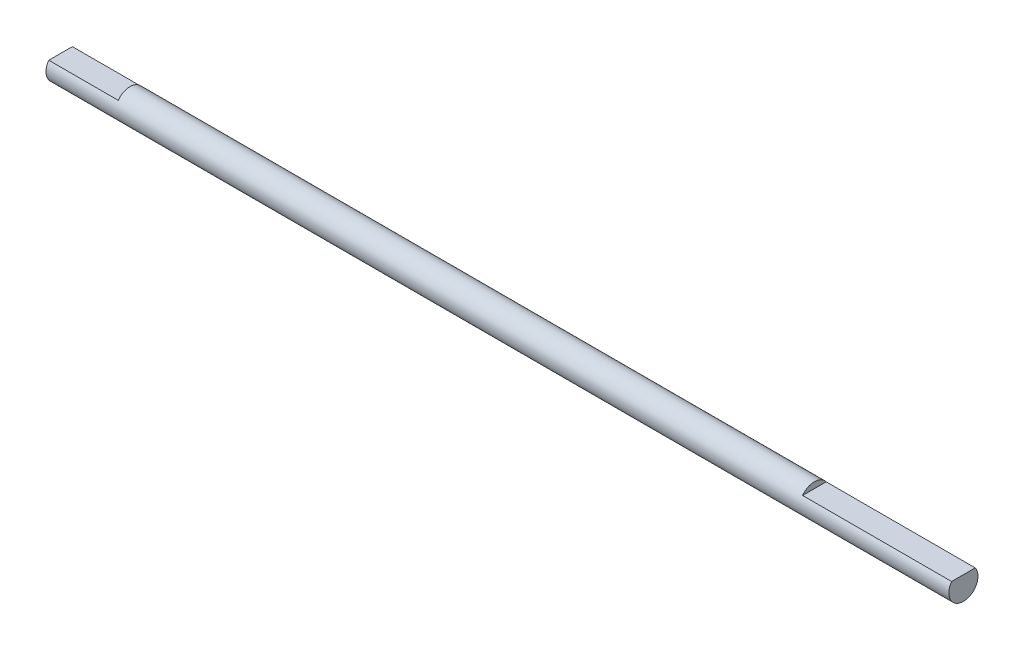
ISO-10303-21;
HEADER;
FILE_DESCRIPTION(('STEP AP214'),'2;1');
FILE_NAME('part.step','',(''),(''),'','','');
FILE_SCHEMA(('AUTOMOTIVE_DESIGN { 1 0 10303 214 1 1 1 1 }'));
ENDSEC;
DATA;
#1=APPLICATION_CONTEXT('core data for automotive mechanical design processes');
#2=APPLICATION_PROTOCOL_DEFINITION('international standard','automotive_design',2000,#1);
#3=PRODUCT_CONTEXT('',#1,'mechanical');
#4=PRODUCT('Part','Part','',(#3));
#5=PRODUCT_RELATED_PRODUCT_CATEGORY('part','',(#4));
#6=PRODUCT_DEFINITION_FORMATION('','',#4);
#7=PRODUCT_DEFINITION_CONTEXT('part definition',#1,'design');
#8=PRODUCT_DEFINITION('design','',#6,#7);
#9=PRODUCT_DEFINITION_SHAPE('','',#8);
#10=(LENGTH_UNIT() NAMED_UNIT(*) SI_UNIT(.MILLI.,.METRE.));
#11=(NAMED_UNIT(*) PLANE_ANGLE_UNIT() SI_UNIT($,.RADIAN.));
#12=(NAMED_UNIT(*) SI_UNIT($,.STERADIAN.) SOLID_ANGLE_UNIT());
#13=UNCERTAINTY_MEASURE_WITH_UNIT(LENGTH_MEASURE(1.E-05),#10,'distance_accuracy_value','');
#14=(GEOMETRIC_REPRESENTATION_CONTEXT(3) GLOBAL_UNCERTAINTY_ASSIGNED_CONTEXT((#13)) GLOBAL_UNIT_ASSIGNED_CONTEXT((#10,
#11,#12)) REPRESENTATION_CONTEXT('',''));
#15=CARTESIAN_POINT('',(0.,0.,0.));
#16=DIRECTION('',(0.,0.,1.));
#17=DIRECTION('',(1.,0.,0.));
#18=AXIS2_PLACEMENT_3D('',#15,#16,#17);
#19=CARTESIAN_POINT('',(123.825,0.,0.));
#20=DIRECTION('',(-1.,0.,0.));
#21=DIRECTION('',(0.,0.,1.));
#22=AXIS2_PLACEMENT_3D('',#19,#20,#21);
#23=CYLINDRICAL_SURFACE('',#22,4.);
#24=CARTESIAN_POINT('',(123.825,0.,0.));
#25=DIRECTION('',(1.,0.,0.));
#26=DIRECTION('',(0.,0.,-1.));
#27=AXIS2_PLACEMENT_3D('',#24,#25,#26);
#28=CIRCLE('',#27,4.);
#29=CARTESIAN_POINT('',(123.825,2.35,3.2368966619279));
#30=VERTEX_POINT('',#29);
#31=CARTESIAN_POINT('',(123.825,2.35,-3.2368966619279));
#32=VERTEX_POINT('',#31);
#33=EDGE_CURVE('E94',#30,#32,#28,.T.);
#34=ORIENTED_EDGE('',*,*,#33,.F.);
#35=DIRECTION('',(-1.,0.,0.));
#36=VECTOR('',#35,1.);
#37=CARTESIAN_POINT('',(123.825,2.35,3.2368966619279));
#38=LINE('',#37,#36);
#39=CARTESIAN_POINT('',(82.946875,2.35,3.2368966619279));
#40=VERTEX_POINT('',#39);
#41=EDGE_CURVE('E59',#30,#40,#38,.T.);
#42=ORIENTED_EDGE('',*,*,#41,.T.);
#43=CARTESIAN_POINT('',(82.946875,0.,0.));
#44=DIRECTION('',(-1.,0.,0.));
#45=DIRECTION('',(0.,0.,1.));
#46=AXIS2_PLACEMENT_3D('',#43,#44,#45);
#47=CIRCLE('',#46,4.);
#48=CARTESIAN_POINT('',(82.946875,2.35,-3.2368966619279));
#49=VERTEX_POINT('',#48);
#50=EDGE_CURVE('E13',#40,#49,#47,.T.);
#51=ORIENTED_EDGE('',*,*,#50,.T.);
#52=DIRECTION('',(-1.,0.,0.));
#53=VECTOR('',#52,1.);
#54=CARTESIAN_POINT('',(123.825,2.35,-3.2368966619279));
#55=LINE('',#54,#53);
#56=EDGE_CURVE('E86',#49,#32,#55,.F.);
#57=ORIENTED_EDGE('',*,*,#56,.T.);
#58=EDGE_LOOP('',(#34,#42,#51,#57));
#59=FACE_BOUND('',#58,.T.);
#60=DIRECTION('',(-1.,0.,0.));
#61=VECTOR('',#60,1.);
#62=CARTESIAN_POINT('',(123.825,2.35,-3.2368966619279));
#63=LINE('',#62,#61);
#64=CARTESIAN_POINT('',(-123.825,2.35,-3.2368966619279));
#65=VERTEX_POINT('',#64);
#66=CARTESIAN_POINT('',(-104.775,2.35,-3.2368966619279));
#67=VERTEX_POINT('',#66);
#68=EDGE_CURVE('E67',#65,#67,#63,.F.);
#69=ORIENTED_EDGE('',*,*,#68,.T.);
#70=CARTESIAN_POINT('',(-104.775,0.,0.));
#71=DIRECTION('',(1.,0.,0.));
#72=DIRECTION('',(0.,0.,-1.));
#73=AXIS2_PLACEMENT_3D('',#70,#71,#72);
#74=CIRCLE('',#73,4.);
#75=CARTESIAN_POINT('',(-104.775,2.35,3.2368966619279));
#76=VERTEX_POINT('',#75);
#77=EDGE_CURVE('E91',#67,#76,#74,.T.);
#78=ORIENTED_EDGE('',*,*,#77,.T.);
#79=DIRECTION('',(-1.,0.,0.));
#80=VECTOR('',#79,1.);
#81=CARTESIAN_POINT('',(123.825,2.35,3.2368966619279));
#82=LINE('',#81,#80);
#83=CARTESIAN_POINT('',(-123.825,2.35,3.2368966619279));
#84=VERTEX_POINT('',#83);
#85=EDGE_CURVE('E103',#76,#84,#82,.T.);
#86=ORIENTED_EDGE('',*,*,#85,.T.);
#87=CARTESIAN_POINT('',(-123.825,0.,0.));
#88=DIRECTION('',(1.,0.,0.));
#89=DIRECTION('',(0.,0.,-1.));
#90=AXIS2_PLACEMENT_3D('',#87,#88,#89);
#91=CIRCLE('',#90,4.);
#92=EDGE_CURVE('E99',#84,#65,#91,.T.);
#93=ORIENTED_EDGE('',*,*,#92,.T.);
#94=EDGE_LOOP('',(#69,#78,#86,#93));
#95=FACE_BOUND('',#94,.T.);
#96=ADVANCED_FACE('F45',(#59,#95),#23,.T.);
#97=CARTESIAN_POINT('',(123.825,0.,0.));
#98=DIRECTION('',(1.,0.,0.));
#99=DIRECTION('',(0.,0.,-1.));
#100=AXIS2_PLACEMENT_3D('',#97,#98,#99);
#101=PLANE('',#100);
#102=DIRECTION('',(0.,0.,-1.));
#103=VECTOR('',#102,1.);
#104=CARTESIAN_POINT('',(123.825,2.35,0.));
#105=LINE('',#104,#103);
#106=EDGE_CURVE('E52',#30,#32,#105,.T.);
#107=ORIENTED_EDGE('',*,*,#106,.F.);
#108=ORIENTED_EDGE('',*,*,#33,.T.);
#109=EDGE_LOOP('',(#107,#108));
#110=FACE_BOUND('',#109,.T.);
#111=ADVANCED_FACE('F97',(#110),#101,.T.);
#112=CARTESIAN_POINT('',(-123.825,0.,0.));
#113=DIRECTION('',(1.,0.,0.));
#114=DIRECTION('',(0.,0.,-1.));
#115=AXIS2_PLACEMENT_3D('',#112,#113,#114);
#116=PLANE('',#115);
#117=ORIENTED_EDGE('',*,*,#92,.F.);
#118=DIRECTION('',(0.,0.,-1.));
#119=VECTOR('',#118,1.);
#120=CARTESIAN_POINT('',(-123.825,2.35,0.));
#121=LINE('',#120,#119);
#122=EDGE_CURVE('E98',#84,#65,#121,.T.);
#123=ORIENTED_EDGE('',*,*,#122,.T.);
#124=EDGE_LOOP('',(#117,#123));
#125=FACE_BOUND('',#124,.T.);
#126=ADVANCED_FACE('F133',(#125),#116,.F.);
#127=CARTESIAN_POINT('',(-104.775,2.35,-4.));
#128=DIRECTION('',(1.,0.,0.));
#129=DIRECTION('',(0.,0.,-1.));
#130=AXIS2_PLACEMENT_3D('',#127,#128,#129);
#131=PLANE('',#130);
#132=DIRECTION('',(0.,0.,1.));
#133=VECTOR('',#132,1.);
#134=CARTESIAN_POINT('',(-104.775,2.35,-4.));
#135=LINE('',#134,#133);
#136=EDGE_CURVE('E114',#67,#76,#135,.T.);
#137=ORIENTED_EDGE('',*,*,#136,.T.);
#138=ORIENTED_EDGE('',*,*,#77,.F.);
#139=EDGE_LOOP('',(#137,#138));
#140=FACE_BOUND('',#139,.T.);
#141=ADVANCED_FACE('F113',(#140),#131,.F.);
#142=CARTESIAN_POINT('',(-123.825,2.35,-4.));
#143=DIRECTION('',(0.,-1.,0.));
#144=DIRECTION('',(0.,0.,-1.));
#145=AXIS2_PLACEMENT_3D('',#142,#143,#144);
#146=PLANE('',#145);
#147=ORIENTED_EDGE('',*,*,#136,.F.);
#148=ORIENTED_EDGE('',*,*,#68,.F.);
#149=ORIENTED_EDGE('',*,*,#122,.F.);
#150=ORIENTED_EDGE('',*,*,#85,.F.);
#151=EDGE_LOOP('',(#147,#148,#149,#150));
#152=FACE_BOUND('',#151,.T.);
#153=ADVANCED_FACE('F115',(#152),#146,.F.);
#154=CARTESIAN_POINT('',(82.946875,4.,-4.));
#155=DIRECTION('',(-1.,0.,0.));
#156=DIRECTION('',(0.,0.,1.));
#157=AXIS2_PLACEMENT_3D('',#154,#155,#156);
#158=PLANE('',#157);
#159=DIRECTION('',(0.,0.,1.));
#160=VECTOR('',#159,1.);
#161=CARTESIAN_POINT('',(82.946875,2.35,-4.));
#162=LINE('',#161,#160);
#163=EDGE_CURVE('E95',#49,#40,#162,.T.);
#164=ORIENTED_EDGE('',*,*,#163,.F.);
#165=ORIENTED_EDGE('',*,*,#50,.F.);
#166=EDGE_LOOP('',(#164,#165));
#167=FACE_BOUND('',#166,.T.);
#168=ADVANCED_FACE('F120',(#167),#158,.F.);
#169=CARTESIAN_POINT('',(82.946875,2.35,-4.));
#170=DIRECTION('',(0.,-1.,0.));
#171=DIRECTION('',(0.,0.,-1.));
#172=AXIS2_PLACEMENT_3D('',#169,#170,#171);
#173=PLANE('',#172);
#174=ORIENTED_EDGE('',*,*,#106,.T.);
#175=ORIENTED_EDGE('',*,*,#56,.F.);
#176=ORIENTED_EDGE('',*,*,#163,.T.);
#177=ORIENTED_EDGE('',*,*,#41,.F.);
#178=EDGE_LOOP('',(#174,#175,#176,#177));
#179=FACE_BOUND('',#178,.T.);
#180=ADVANCED_FACE('F85',(#179),#173,.F.);
#181=CLOSED_SHELL('',(#96,#111,#126,#141,#153,#168,#180));
#182=MANIFOLD_SOLID_BREP('B2',#181);
#183=ADVANCED_BREP_SHAPE_REPRESENTATION('',(#18,#182),#14);
#184=SHAPE_DEFINITION_REPRESENTATION(#9,#183);
ENDSEC;
END-ISO-10303-21;
